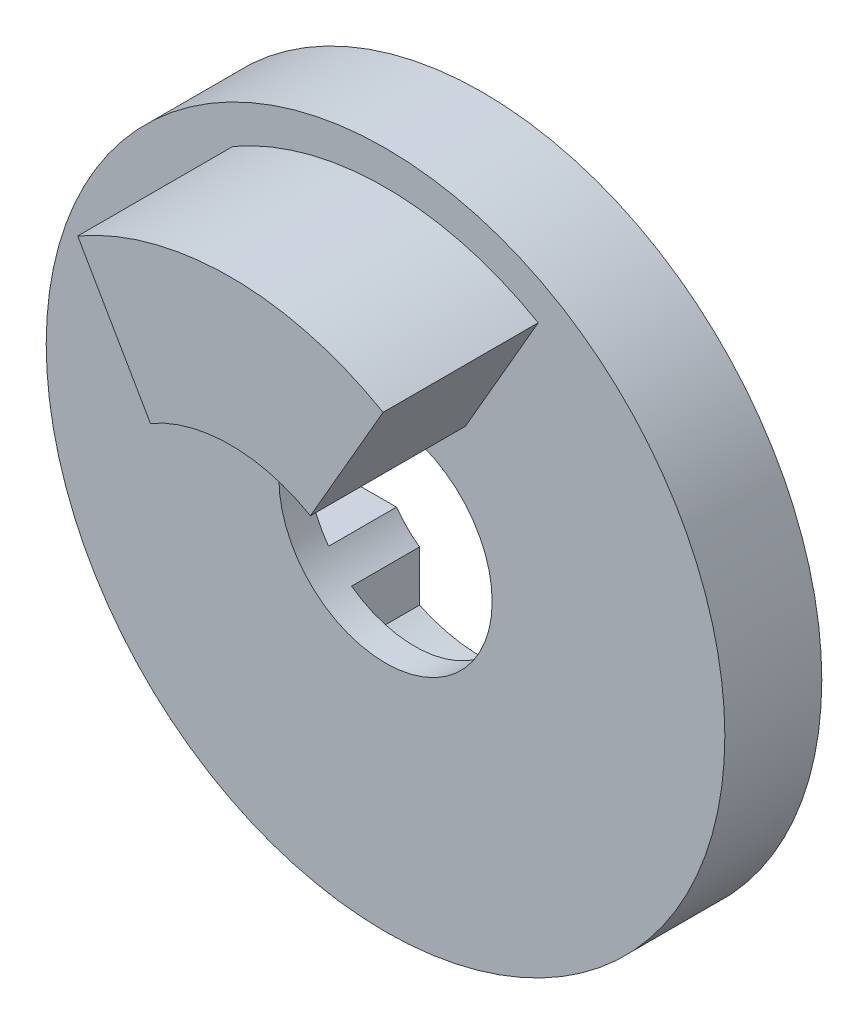
ISO-10303-21;
HEADER;
FILE_DESCRIPTION(('STEP AP214'),'2;1');
FILE_NAME('part.step','',(''),(''),'','','');
FILE_SCHEMA(('AUTOMOTIVE_DESIGN { 1 0 10303 214 1 1 1 1 }'));
ENDSEC;
DATA;
#1=APPLICATION_CONTEXT('core data for automotive mechanical design processes');
#2=APPLICATION_PROTOCOL_DEFINITION('international standard','automotive_design',2000,#1);
#3=PRODUCT_CONTEXT('',#1,'mechanical');
#4=PRODUCT('Part','Part','',(#3));
#5=PRODUCT_RELATED_PRODUCT_CATEGORY('part','',(#4));
#6=PRODUCT_DEFINITION_FORMATION('','',#4);
#7=PRODUCT_DEFINITION_CONTEXT('part definition',#1,'design');
#8=PRODUCT_DEFINITION('design','',#6,#7);
#9=PRODUCT_DEFINITION_SHAPE('','',#8);
#10=(LENGTH_UNIT() NAMED_UNIT(*) SI_UNIT(.MILLI.,.METRE.));
#11=(NAMED_UNIT(*) PLANE_ANGLE_UNIT() SI_UNIT($,.RADIAN.));
#12=(NAMED_UNIT(*) SI_UNIT($,.STERADIAN.) SOLID_ANGLE_UNIT());
#13=UNCERTAINTY_MEASURE_WITH_UNIT(LENGTH_MEASURE(1.E-05),#10,'distance_accuracy_value','');
#14=(GEOMETRIC_REPRESENTATION_CONTEXT(3) GLOBAL_UNCERTAINTY_ASSIGNED_CONTEXT((#13)) GLOBAL_UNIT_ASSIGNED_CONTEXT((#10,
#11,#12)) REPRESENTATION_CONTEXT('',''));
#15=CARTESIAN_POINT('',(0.,0.,0.));
#16=DIRECTION('',(0.,0.,1.));
#17=DIRECTION('',(1.,0.,0.));
#18=AXIS2_PLACEMENT_3D('',#15,#16,#17);
#19=CARTESIAN_POINT('',(0.,0.,-2.5));
#20=DIRECTION('',(0.,0.,1.));
#21=DIRECTION('',(1.,0.,0.));
#22=AXIS2_PLACEMENT_3D('',#19,#20,#21);
#23=PLANE('',#22);
#24=CARTESIAN_POINT('',(0.,0.,-2.5));
#25=DIRECTION('',(0.,0.,-1.));
#26=DIRECTION('',(1.,0.,0.));
#27=AXIS2_PLACEMENT_3D('',#24,#25,#26);
#28=CIRCLE('',#27,7.75000000000003);
#29=CARTESIAN_POINT('',(-3.25,7.03562363973514,-2.5));
#30=VERTEX_POINT('',#29);
#31=CARTESIAN_POINT('',(3.25,7.03562363973514,-2.5));
#32=VERTEX_POINT('',#31);
#33=EDGE_CURVE('E184',#30,#32,#28,.T.);
#34=ORIENTED_EDGE('',*,*,#33,.F.);
#35=DIRECTION('',(0.,1.,0.));
#36=VECTOR('',#35,1.);
#37=CARTESIAN_POINT('',(-3.25,4.43705983732468,-2.5));
#38=LINE('',#37,#36);
#39=CARTESIAN_POINT('',(-3.25,4.43705983732468,-2.5));
#40=VERTEX_POINT('',#39);
#41=EDGE_CURVE('E197',#40,#30,#38,.T.);
#42=ORIENTED_EDGE('',*,*,#41,.F.);
#43=CARTESIAN_POINT('',(0.,0.,-2.5));
#44=DIRECTION('',(0.,0.,1.));
#45=DIRECTION('',(1.,0.,0.));
#46=AXIS2_PLACEMENT_3D('',#43,#44,#45);
#47=CIRCLE('',#46,5.5);
#48=CARTESIAN_POINT('',(-4.43705983732471,3.25,-2.5));
#49=VERTEX_POINT('',#48);
#50=EDGE_CURVE('E301',#40,#49,#47,.T.);
#51=ORIENTED_EDGE('',*,*,#50,.T.);
#52=DIRECTION('',(1.,0.,0.));
#53=VECTOR('',#52,1.);
#54=CARTESIAN_POINT('',(-4.43705983732471,3.25,-2.5));
#55=LINE('',#54,#53);
#56=CARTESIAN_POINT('',(-7.03562363973515,3.25,-2.5));
#57=VERTEX_POINT('',#56);
#58=EDGE_CURVE('E285',#57,#49,#55,.T.);
#59=ORIENTED_EDGE('',*,*,#58,.F.);
#60=CARTESIAN_POINT('',(0.,0.,-2.5));
#61=DIRECTION('',(0.,0.,-1.));
#62=DIRECTION('',(1.,0.,0.));
#63=AXIS2_PLACEMENT_3D('',#60,#61,#62);
#64=CIRCLE('',#63,7.75);
#65=CARTESIAN_POINT('',(-7.03562363973515,-3.25,-2.5));
#66=VERTEX_POINT('',#65);
#67=EDGE_CURVE('E282',#66,#57,#64,.T.);
#68=ORIENTED_EDGE('',*,*,#67,.F.);
#69=DIRECTION('',(-1.,0.,0.));
#70=VECTOR('',#69,1.);
#71=CARTESIAN_POINT('',(-7.03562363973515,-3.25,-2.5));
#72=LINE('',#71,#70);
#73=CARTESIAN_POINT('',(-4.43705983732471,-3.25,-2.5));
#74=VERTEX_POINT('',#73);
#75=EDGE_CURVE('E274',#74,#66,#72,.T.);
#76=ORIENTED_EDGE('',*,*,#75,.F.);
#77=CARTESIAN_POINT('',(-3.25,-4.43705983732474,-2.5));
#78=VERTEX_POINT('',#77);
#79=EDGE_CURVE('E653',#74,#78,#47,.T.);
#80=ORIENTED_EDGE('',*,*,#79,.T.);
#81=DIRECTION('',(0.,1.,0.));
#82=VECTOR('',#81,1.);
#83=CARTESIAN_POINT('',(-3.25,-4.43705983732474,-2.5));
#84=LINE('',#83,#82);
#85=CARTESIAN_POINT('',(-3.25,-7.03562363973515,-2.5));
#86=VERTEX_POINT('',#85);
#87=EDGE_CURVE('E220',#86,#78,#84,.T.);
#88=ORIENTED_EDGE('',*,*,#87,.F.);
#89=CARTESIAN_POINT('',(0.,0.,-2.5));
#90=DIRECTION('',(0.,0.,-1.));
#91=DIRECTION('',(-1.,0.,0.));
#92=AXIS2_PLACEMENT_3D('',#89,#90,#91);
#93=CIRCLE('',#92,7.74999999999997);
#94=CARTESIAN_POINT('',(3.25,-7.03562363973514,-2.5));
#95=VERTEX_POINT('',#94);
#96=EDGE_CURVE('E230',#95,#86,#93,.T.);
#97=ORIENTED_EDGE('',*,*,#96,.F.);
#98=DIRECTION('',(0.,-1.,0.));
#99=VECTOR('',#98,1.);
#100=CARTESIAN_POINT('',(3.25,-7.03562363973514,-2.5));
#101=LINE('',#100,#99);
#102=CARTESIAN_POINT('',(3.25,-4.43705983732474,-2.5));
#103=VERTEX_POINT('',#102);
#104=EDGE_CURVE('E227',#103,#95,#101,.T.);
#105=ORIENTED_EDGE('',*,*,#104,.F.);
#106=CARTESIAN_POINT('',(4.43705983732471,-3.25,-2.5));
#107=VERTEX_POINT('',#106);
#108=EDGE_CURVE('E213',#103,#107,#47,.T.);
#109=ORIENTED_EDGE('',*,*,#108,.T.);
#110=DIRECTION('',(-1.,0.,0.));
#111=VECTOR('',#110,1.);
#112=CARTESIAN_POINT('',(7.03562363973514,-3.25,-2.5));
#113=LINE('',#112,#111);
#114=CARTESIAN_POINT('',(7.03562363973514,-3.25,-2.5));
#115=VERTEX_POINT('',#114);
#116=EDGE_CURVE('E246',#115,#107,#113,.T.);
#117=ORIENTED_EDGE('',*,*,#116,.F.);
#118=CARTESIAN_POINT('',(0.,0.,-2.5));
#119=DIRECTION('',(0.,0.,-1.));
#120=DIRECTION('',(-1.,0.,0.));
#121=AXIS2_PLACEMENT_3D('',#118,#119,#120);
#122=CIRCLE('',#121,7.75);
#123=CARTESIAN_POINT('',(7.03562363973514,3.25,-2.5));
#124=VERTEX_POINT('',#123);
#125=EDGE_CURVE('E258',#124,#115,#122,.T.);
#126=ORIENTED_EDGE('',*,*,#125,.F.);
#127=DIRECTION('',(1.,0.,0.));
#128=VECTOR('',#127,1.);
#129=CARTESIAN_POINT('',(4.43705983732471,3.25,-2.5));
#130=LINE('',#129,#128);
#131=CARTESIAN_POINT('',(4.43705983732471,3.25,-2.5));
#132=VERTEX_POINT('',#131);
#133=EDGE_CURVE('E255',#132,#124,#130,.T.);
#134=ORIENTED_EDGE('',*,*,#133,.F.);
#135=CARTESIAN_POINT('',(3.25,4.43705983732468,-2.5));
#136=VERTEX_POINT('',#135);
#137=EDGE_CURVE('E297',#132,#136,#47,.T.);
#138=ORIENTED_EDGE('',*,*,#137,.T.);
#139=DIRECTION('',(0.,-1.,0.));
#140=VECTOR('',#139,1.);
#141=CARTESIAN_POINT('',(3.25,7.03562363973514,-2.5));
#142=LINE('',#141,#140);
#143=EDGE_CURVE('E200',#32,#136,#142,.T.);
#144=ORIENTED_EDGE('',*,*,#143,.F.);
#145=EDGE_LOOP('',(#34,#42,#51,#59,#68,#76,#80,#88,#97,#105,#109,#117,#126,#134,#138,#144));
#146=FACE_BOUND('',#145,.T.);
#147=CARTESIAN_POINT('',(0.,0.,-2.5));
#148=DIRECTION('',(0.,0.,-1.));
#149=DIRECTION('',(-1.,0.,0.));
#150=AXIS2_PLACEMENT_3D('',#147,#148,#149);
#151=CIRCLE('',#150,8.);
#152=CARTESIAN_POINT('',(-8.,0.,-2.5));
#153=VERTEX_POINT('',#152);
#154=EDGE_CURVE('E363',#153,#153,#151,.T.);
#155=ORIENTED_EDGE('',*,*,#154,.T.);
#156=EDGE_LOOP('',(#155));
#157=FACE_BOUND('',#156,.T.);
#158=ADVANCED_FACE('F39',(#146,#157),#23,.F.);
#159=CARTESIAN_POINT('',(0.,0.,2.5));
#160=DIRECTION('',(0.,0.,1.));
#161=DIRECTION('',(1.,0.,0.));
#162=AXIS2_PLACEMENT_3D('',#159,#160,#161);
#163=PLANE('',#162);
#164=CARTESIAN_POINT('',(0.,0.,2.5));
#165=DIRECTION('',(0.,0.,1.));
#166=DIRECTION('',(1.,0.,0.));
#167=AXIS2_PLACEMENT_3D('',#164,#165,#166);
#168=CIRCLE('',#167,5.5);
#169=CARTESIAN_POINT('',(5.5,0.,2.5));
#170=VERTEX_POINT('',#169);
#171=EDGE_CURVE('E300',#170,#170,#168,.T.);
#172=ORIENTED_EDGE('',*,*,#171,.F.);
#173=EDGE_LOOP('',(#172));
#174=FACE_BOUND('',#173,.T.);
#175=CARTESIAN_POINT('',(0.,0.,2.5));
#176=DIRECTION('',(0.,0.,1.));
#177=DIRECTION('',(1.,0.,0.));
#178=AXIS2_PLACEMENT_3D('',#175,#176,#177);
#179=CIRCLE('',#178,17.5);
#180=CARTESIAN_POINT('',(17.5,0.,2.5));
#181=VERTEX_POINT('',#180);
#182=EDGE_CURVE('E11',#181,#181,#179,.T.);
#183=ORIENTED_EDGE('',*,*,#182,.T.);
#184=EDGE_LOOP('',(#183));
#185=FACE_BOUND('',#184,.T.);
#186=DIRECTION('',(0.499999999999996,-0.866025403784441,0.));
#187=VECTOR('',#186,1.);
#188=CARTESIAN_POINT('',(-4.12499999999996,7.14470958122165,2.5));
#189=LINE('',#188,#187);
#190=CARTESIAN_POINT('',(-7.87499999999993,13.639900109605,2.5));
#191=VERTEX_POINT('',#190);
#192=CARTESIAN_POINT('',(-4.12499999999996,7.14470958122165,2.5));
#193=VERTEX_POINT('',#192);
#194=EDGE_CURVE('E318',#191,#193,#189,.T.);
#195=ORIENTED_EDGE('',*,*,#194,.F.);
#196=CARTESIAN_POINT('',(0.,0.,2.5));
#197=DIRECTION('',(0.,0.,1.));
#198=DIRECTION('',(-1.,0.,0.));
#199=AXIS2_PLACEMENT_3D('',#196,#197,#198);
#200=CIRCLE('',#199,15.75);
#201=CARTESIAN_POINT('',(7.87499999999993,13.639900109605,2.5));
#202=VERTEX_POINT('',#201);
#203=EDGE_CURVE('E304',#202,#191,#200,.T.);
#204=ORIENTED_EDGE('',*,*,#203,.F.);
#205=DIRECTION('',(0.499999999999995,0.866025403784441,0.));
#206=VECTOR('',#205,1.);
#207=CARTESIAN_POINT('',(7.87499999999993,13.639900109605,2.5));
#208=LINE('',#207,#206);
#209=CARTESIAN_POINT('',(4.12499999999996,7.14470958122164,2.5));
#210=VERTEX_POINT('',#209);
#211=EDGE_CURVE('E309',#210,#202,#208,.T.);
#212=ORIENTED_EDGE('',*,*,#211,.F.);
#213=CARTESIAN_POINT('',(0.,0.,2.5));
#214=DIRECTION('',(0.,0.,-1.));
#215=DIRECTION('',(1.,0.,0.));
#216=AXIS2_PLACEMENT_3D('',#213,#214,#215);
#217=CIRCLE('',#216,8.25);
#218=EDGE_CURVE('E320',#193,#210,#217,.T.);
#219=ORIENTED_EDGE('',*,*,#218,.F.);
#220=EDGE_LOOP('',(#195,#204,#212,#219));
#221=FACE_BOUND('',#220,.T.);
#222=ADVANCED_FACE('F349',(#174,#185,#221),#163,.T.);
#223=CARTESIAN_POINT('',(0.,0.,2.5));
#224=DIRECTION('',(0.,0.,-1.));
#225=DIRECTION('',(-1.,0.,0.));
#226=AXIS2_PLACEMENT_3D('',#223,#224,#225);
#227=CYLINDRICAL_SURFACE('',#226,17.5);
#228=ORIENTED_EDGE('',*,*,#182,.F.);
#229=EDGE_LOOP('',(#228));
#230=FACE_BOUND('',#229,.T.);
#231=CARTESIAN_POINT('',(0.,0.,-2.5));
#232=DIRECTION('',(0.,0.,1.));
#233=DIRECTION('',(1.,0.,0.));
#234=AXIS2_PLACEMENT_3D('',#231,#232,#233);
#235=CIRCLE('',#234,17.5);
#236=CARTESIAN_POINT('',(17.5,0.,-2.5));
#237=VERTEX_POINT('',#236);
#238=EDGE_CURVE('E43',#237,#237,#235,.T.);
#239=ORIENTED_EDGE('',*,*,#238,.T.);
#240=EDGE_LOOP('',(#239));
#241=FACE_BOUND('',#240,.T.);
#242=ADVANCED_FACE('F41',(#230,#241),#227,.T.);
#243=CARTESIAN_POINT('',(0.,0.,-2.5));
#244=DIRECTION('',(0.,0.,-1.));
#245=DIRECTION('',(-1.,0.,0.));
#246=AXIS2_PLACEMENT_3D('',#243,#244,#245);
#247=CIRCLE('',#246,13.);
#248=CARTESIAN_POINT('',(-13.,0.,-2.5));
#249=VERTEX_POINT('',#248);
#250=EDGE_CURVE('E203',#249,#249,#247,.T.);
#251=ORIENTED_EDGE('',*,*,#250,.F.);
#252=EDGE_LOOP('',(#251));
#253=FACE_BOUND('',#252,.T.);
#254=ORIENTED_EDGE('',*,*,#238,.F.);
#255=EDGE_LOOP('',(#254));
#256=FACE_BOUND('',#255,.T.);
#257=ADVANCED_FACE('F338',(#253,#256),#23,.F.);
#258=CARTESIAN_POINT('',(0.,0.,10.5));
#259=DIRECTION('',(0.,0.,-1.));
#260=DIRECTION('',(-1.,0.,0.));
#261=AXIS2_PLACEMENT_3D('',#258,#259,#260);
#262=CYLINDRICAL_SURFACE('',#261,15.75);
#263=ORIENTED_EDGE('',*,*,#203,.T.);
#264=DIRECTION('',(0.,0.,-1.));
#265=VECTOR('',#264,1.);
#266=CARTESIAN_POINT('',(-7.87499999999993,13.639900109605,10.5));
#267=LINE('',#266,#265);
#268=CARTESIAN_POINT('',(-7.87499999999993,13.639900109605,10.5));
#269=VERTEX_POINT('',#268);
#270=EDGE_CURVE('E331',#269,#191,#267,.T.);
#271=ORIENTED_EDGE('',*,*,#270,.F.);
#272=CARTESIAN_POINT('',(0.,0.,10.5));
#273=DIRECTION('',(0.,0.,1.));
#274=DIRECTION('',(-1.,0.,0.));
#275=AXIS2_PLACEMENT_3D('',#272,#273,#274);
#276=CIRCLE('',#275,15.75);
#277=CARTESIAN_POINT('',(7.87499999999993,13.639900109605,10.5));
#278=VERTEX_POINT('',#277);
#279=EDGE_CURVE('E305',#278,#269,#276,.T.);
#280=ORIENTED_EDGE('',*,*,#279,.F.);
#281=DIRECTION('',(0.,0.,-1.));
#282=VECTOR('',#281,1.);
#283=CARTESIAN_POINT('',(7.87499999999993,13.639900109605,10.5));
#284=LINE('',#283,#282);
#285=EDGE_CURVE('E315',#278,#202,#284,.T.);
#286=ORIENTED_EDGE('',*,*,#285,.T.);
#287=EDGE_LOOP('',(#263,#271,#280,#286));
#288=FACE_BOUND('',#287,.T.);
#289=ADVANCED_FACE('F340',(#288),#262,.T.);
#290=CARTESIAN_POINT('',(-4.12499999999996,7.14470958122165,10.5));
#291=DIRECTION('',(0.866025403784441,0.499999999999996,0.));
#292=DIRECTION('',(-0.499999999999996,0.866025403784441,0.));
#293=AXIS2_PLACEMENT_3D('',#290,#291,#292);
#294=PLANE('',#293);
#295=ORIENTED_EDGE('',*,*,#194,.T.);
#296=DIRECTION('',(0.,0.,-1.));
#297=VECTOR('',#296,1.);
#298=CARTESIAN_POINT('',(-4.12499999999996,7.14470958122165,10.5));
#299=LINE('',#298,#297);
#300=CARTESIAN_POINT('',(-4.12499999999996,7.14470958122165,10.5));
#301=VERTEX_POINT('',#300);
#302=EDGE_CURVE('E328',#301,#193,#299,.T.);
#303=ORIENTED_EDGE('',*,*,#302,.F.);
#304=DIRECTION('',(0.499999999999996,-0.866025403784441,0.));
#305=VECTOR('',#304,1.);
#306=CARTESIAN_POINT('',(-4.12499999999996,7.14470958122165,10.5));
#307=LINE('',#306,#305);
#308=EDGE_CURVE('E308',#269,#301,#307,.T.);
#309=ORIENTED_EDGE('',*,*,#308,.F.);
#310=ORIENTED_EDGE('',*,*,#270,.T.);
#311=EDGE_LOOP('',(#295,#303,#309,#310));
#312=FACE_BOUND('',#311,.T.);
#313=ADVANCED_FACE('F346',(#312),#294,.F.);
#314=CARTESIAN_POINT('',(0.,0.,10.5));
#315=DIRECTION('',(0.,0.,-1.));
#316=DIRECTION('',(-1.,0.,0.));
#317=AXIS2_PLACEMENT_3D('',#314,#315,#316);
#318=CYLINDRICAL_SURFACE('',#317,8.25);
#319=ORIENTED_EDGE('',*,*,#218,.T.);
#320=DIRECTION('',(0.,0.,-1.));
#321=VECTOR('',#320,1.);
#322=CARTESIAN_POINT('',(4.12499999999996,7.14470958122164,10.5));
#323=LINE('',#322,#321);
#324=CARTESIAN_POINT('',(4.12499999999996,7.14470958122164,10.5));
#325=VERTEX_POINT('',#324);
#326=EDGE_CURVE('E326',#325,#210,#323,.T.);
#327=ORIENTED_EDGE('',*,*,#326,.F.);
#328=CARTESIAN_POINT('',(0.,0.,10.5));
#329=DIRECTION('',(0.,0.,-1.));
#330=DIRECTION('',(1.,0.,0.));
#331=AXIS2_PLACEMENT_3D('',#328,#329,#330);
#332=CIRCLE('',#331,8.25);
#333=EDGE_CURVE('E311',#301,#325,#332,.T.);
#334=ORIENTED_EDGE('',*,*,#333,.F.);
#335=ORIENTED_EDGE('',*,*,#302,.T.);
#336=EDGE_LOOP('',(#319,#327,#334,#335));
#337=FACE_BOUND('',#336,.T.);
#338=ADVANCED_FACE('F455',(#337),#318,.F.);
#339=CARTESIAN_POINT('',(7.87499999999993,13.639900109605,10.5));
#340=DIRECTION('',(-0.866025403784441,0.499999999999995,0.));
#341=DIRECTION('',(-0.499999999999995,-0.866025403784441,0.));
#342=AXIS2_PLACEMENT_3D('',#339,#340,#341);
#343=PLANE('',#342);
#344=ORIENTED_EDGE('',*,*,#211,.T.);
#345=ORIENTED_EDGE('',*,*,#285,.F.);
#346=DIRECTION('',(0.499999999999995,0.866025403784441,0.));
#347=VECTOR('',#346,1.);
#348=CARTESIAN_POINT('',(7.87499999999993,13.639900109605,10.5));
#349=LINE('',#348,#347);
#350=EDGE_CURVE('E313',#325,#278,#349,.T.);
#351=ORIENTED_EDGE('',*,*,#350,.F.);
#352=ORIENTED_EDGE('',*,*,#326,.T.);
#353=EDGE_LOOP('',(#344,#345,#351,#352));
#354=FACE_BOUND('',#353,.T.);
#355=ADVANCED_FACE('F451',(#354),#343,.F.);
#356=CARTESIAN_POINT('',(0.,0.,10.5));
#357=DIRECTION('',(0.,0.,-1.));
#358=DIRECTION('',(-1.,0.,0.));
#359=AXIS2_PLACEMENT_3D('',#356,#357,#358);
#360=PLANE('',#359);
#361=ORIENTED_EDGE('',*,*,#279,.T.);
#362=ORIENTED_EDGE('',*,*,#308,.T.);
#363=ORIENTED_EDGE('',*,*,#333,.T.);
#364=ORIENTED_EDGE('',*,*,#350,.T.);
#365=EDGE_LOOP('',(#361,#362,#363,#364));
#366=FACE_BOUND('',#365,.T.);
#367=ADVANCED_FACE('F447',(#366),#360,.F.);
#368=CARTESIAN_POINT('',(0.,0.,-2.5));
#369=DIRECTION('',(0.,0.,1.));
#370=DIRECTION('',(1.,0.,0.));
#371=AXIS2_PLACEMENT_3D('',#368,#369,#370);
#372=CYLINDRICAL_SURFACE('',#371,5.5);
#373=ORIENTED_EDGE('',*,*,#50,.F.);
#374=DIRECTION('',(0.,0.,-1.));
#375=VECTOR('',#374,1.);
#376=CARTESIAN_POINT('',(-3.25,4.43705983732468,1.));
#377=LINE('',#376,#375);
#378=CARTESIAN_POINT('',(-3.25,4.43705983732468,1.));
#379=VERTEX_POINT('',#378);
#380=EDGE_CURVE('E214',#379,#40,#377,.T.);
#381=ORIENTED_EDGE('',*,*,#380,.F.);
#382=CARTESIAN_POINT('',(0.,0.,1.));
#383=DIRECTION('',(0.,0.,1.));
#384=DIRECTION('',(1.,0.,0.));
#385=AXIS2_PLACEMENT_3D('',#382,#383,#384);
#386=CIRCLE('',#385,5.5);
#387=CARTESIAN_POINT('',(3.25000000000002,4.4370598373247,1.));
#388=VERTEX_POINT('',#387);
#389=EDGE_CURVE('E193',#388,#379,#386,.T.);
#390=ORIENTED_EDGE('',*,*,#389,.F.);
#391=DIRECTION('',(0.,0.,-1.));
#392=VECTOR('',#391,1.);
#393=CARTESIAN_POINT('',(3.25,4.43705983732468,1.));
#394=LINE('',#393,#392);
#395=EDGE_CURVE('E187',#388,#136,#394,.T.);
#396=ORIENTED_EDGE('',*,*,#395,.T.);
#397=ORIENTED_EDGE('',*,*,#137,.F.);
#398=DIRECTION('',(0.,0.,-1.));
#399=VECTOR('',#398,1.);
#400=CARTESIAN_POINT('',(4.43705983732471,3.25,1.));
#401=LINE('',#400,#399);
#402=CARTESIAN_POINT('',(4.43705983732471,3.25,1.));
#403=VERTEX_POINT('',#402);
#404=EDGE_CURVE('E254',#403,#132,#401,.T.);
#405=ORIENTED_EDGE('',*,*,#404,.F.);
#406=CARTESIAN_POINT('',(0.,0.,1.));
#407=DIRECTION('',(0.,0.,1.));
#408=DIRECTION('',(-1.,0.,0.));
#409=AXIS2_PLACEMENT_3D('',#406,#407,#408);
#410=CIRCLE('',#409,5.5);
#411=CARTESIAN_POINT('',(4.43705983732471,-3.25,1.));
#412=VERTEX_POINT('',#411);
#413=EDGE_CURVE('E242',#412,#403,#410,.T.);
#414=ORIENTED_EDGE('',*,*,#413,.F.);
#415=DIRECTION('',(0.,0.,-1.));
#416=VECTOR('',#415,1.);
#417=CARTESIAN_POINT('',(4.43705983732471,-3.25,1.));
#418=LINE('',#417,#416);
#419=EDGE_CURVE('E231',#412,#107,#418,.T.);
#420=ORIENTED_EDGE('',*,*,#419,.T.);
#421=ORIENTED_EDGE('',*,*,#108,.F.);
#422=DIRECTION('',(0.,0.,-1.));
#423=VECTOR('',#422,1.);
#424=CARTESIAN_POINT('',(3.25,-4.43705983732474,1.));
#425=LINE('',#424,#423);
#426=CARTESIAN_POINT('',(3.25,-4.43705983732474,1.));
#427=VERTEX_POINT('',#426);
#428=EDGE_CURVE('E226',#427,#103,#425,.T.);
#429=ORIENTED_EDGE('',*,*,#428,.F.);
#430=CARTESIAN_POINT('',(0.,0.,1.));
#431=DIRECTION('',(0.,0.,1.));
#432=DIRECTION('',(-1.,0.,0.));
#433=AXIS2_PLACEMENT_3D('',#430,#431,#432);
#434=CIRCLE('',#433,5.5);
#435=CARTESIAN_POINT('',(-3.24999999999998,-4.43705983732472,1.));
#436=VERTEX_POINT('',#435);
#437=EDGE_CURVE('E217',#436,#427,#434,.T.);
#438=ORIENTED_EDGE('',*,*,#437,.F.);
#439=DIRECTION('',(0.,0.,-1.));
#440=VECTOR('',#439,1.);
#441=CARTESIAN_POINT('',(-3.25,-4.43705983732474,1.));
#442=LINE('',#441,#440);
#443=EDGE_CURVE('E209',#436,#78,#442,.T.);
#444=ORIENTED_EDGE('',*,*,#443,.T.);
#445=ORIENTED_EDGE('',*,*,#79,.F.);
#446=DIRECTION('',(0.,0.,-1.));
#447=VECTOR('',#446,1.);
#448=CARTESIAN_POINT('',(-4.43705983732471,-3.25,1.));
#449=LINE('',#448,#447);
#450=CARTESIAN_POINT('',(-4.43705983732471,-3.25,1.));
#451=VERTEX_POINT('',#450);
#452=EDGE_CURVE('E291',#451,#74,#449,.T.);
#453=ORIENTED_EDGE('',*,*,#452,.F.);
#454=CARTESIAN_POINT('',(0.,0.,1.));
#455=DIRECTION('',(0.,0.,1.));
#456=DIRECTION('',(1.,0.,0.));
#457=AXIS2_PLACEMENT_3D('',#454,#455,#456);
#458=CIRCLE('',#457,5.5);
#459=CARTESIAN_POINT('',(-4.43705983732471,3.25,1.));
#460=VERTEX_POINT('',#459);
#461=EDGE_CURVE('E276',#460,#451,#458,.T.);
#462=ORIENTED_EDGE('',*,*,#461,.F.);
#463=DIRECTION('',(0.,0.,-1.));
#464=VECTOR('',#463,1.);
#465=CARTESIAN_POINT('',(-4.43705983732471,3.25,1.));
#466=LINE('',#465,#464);
#467=EDGE_CURVE('E293',#460,#49,#466,.T.);
#468=ORIENTED_EDGE('',*,*,#467,.T.);
#469=EDGE_LOOP('',(#373,#381,#390,#396,#397,#405,#414,#420,#421,#429,#438,#444,#445,#453,#462,#468));
#470=FACE_BOUND('',#469,.T.);
#471=ORIENTED_EDGE('',*,*,#171,.T.);
#472=EDGE_LOOP('',(#471));
#473=FACE_BOUND('',#472,.T.);
#474=ADVANCED_FACE('F443',(#470,#473),#372,.F.);
#475=CARTESIAN_POINT('',(0.,0.,1.));
#476=DIRECTION('',(0.,0.,-1.));
#477=DIRECTION('',(-1.,0.,0.));
#478=AXIS2_PLACEMENT_3D('',#475,#476,#477);
#479=CYLINDRICAL_SURFACE('',#478,7.75);
#480=ORIENTED_EDGE('',*,*,#67,.T.);
#481=DIRECTION('',(0.,0.,-1.));
#482=VECTOR('',#481,1.);
#483=CARTESIAN_POINT('',(-7.03562363973515,3.25,1.));
#484=LINE('',#483,#482);
#485=CARTESIAN_POINT('',(-7.03562363973515,3.25,1.));
#486=VERTEX_POINT('',#485);
#487=EDGE_CURVE('E281',#486,#57,#484,.T.);
#488=ORIENTED_EDGE('',*,*,#487,.F.);
#489=CARTESIAN_POINT('',(0.,0.,1.));
#490=DIRECTION('',(0.,0.,-1.));
#491=DIRECTION('',(1.,0.,0.));
#492=AXIS2_PLACEMENT_3D('',#489,#490,#491);
#493=CIRCLE('',#492,7.75);
#494=CARTESIAN_POINT('',(-7.03562363973515,-3.25,1.));
#495=VERTEX_POINT('',#494);
#496=EDGE_CURVE('E270',#495,#486,#493,.T.);
#497=ORIENTED_EDGE('',*,*,#496,.F.);
#498=DIRECTION('',(0.,0.,-1.));
#499=VECTOR('',#498,1.);
#500=CARTESIAN_POINT('',(-7.03562363973515,-3.25,1.));
#501=LINE('',#500,#499);
#502=EDGE_CURVE('E259',#495,#66,#501,.T.);
#503=ORIENTED_EDGE('',*,*,#502,.T.);
#504=EDGE_LOOP('',(#480,#488,#497,#503));
#505=FACE_BOUND('',#504,.T.);
#506=ADVANCED_FACE('F436',(#505),#479,.F.);
#507=CARTESIAN_POINT('',(-7.03562363973515,-3.25,1.));
#508=DIRECTION('',(0.,-1.,0.));
#509=DIRECTION('',(0.,0.,-1.));
#510=AXIS2_PLACEMENT_3D('',#507,#508,#509);
#511=PLANE('',#510);
#512=ORIENTED_EDGE('',*,*,#75,.T.);
#513=ORIENTED_EDGE('',*,*,#502,.F.);
#514=DIRECTION('',(-1.,0.,0.));
#515=VECTOR('',#514,1.);
#516=CARTESIAN_POINT('',(-7.03562363973515,-3.25,1.));
#517=LINE('',#516,#515);
#518=EDGE_CURVE('E278',#451,#495,#517,.T.);
#519=ORIENTED_EDGE('',*,*,#518,.F.);
#520=ORIENTED_EDGE('',*,*,#452,.T.);
#521=EDGE_LOOP('',(#512,#513,#519,#520));
#522=FACE_BOUND('',#521,.T.);
#523=ADVANCED_FACE('F433',(#522),#511,.F.);
#524=CARTESIAN_POINT('',(-4.43705983732471,3.25,1.));
#525=DIRECTION('',(0.,1.,0.));
#526=DIRECTION('',(0.,0.,1.));
#527=AXIS2_PLACEMENT_3D('',#524,#525,#526);
#528=PLANE('',#527);
#529=ORIENTED_EDGE('',*,*,#58,.T.);
#530=ORIENTED_EDGE('',*,*,#467,.F.);
#531=DIRECTION('',(1.,0.,0.));
#532=VECTOR('',#531,1.);
#533=CARTESIAN_POINT('',(-4.43705983732471,3.25,1.));
#534=LINE('',#533,#532);
#535=EDGE_CURVE('E273',#486,#460,#534,.T.);
#536=ORIENTED_EDGE('',*,*,#535,.F.);
#537=ORIENTED_EDGE('',*,*,#487,.T.);
#538=EDGE_LOOP('',(#529,#530,#536,#537));
#539=FACE_BOUND('',#538,.T.);
#540=ADVANCED_FACE('F431',(#539),#528,.F.);
#541=CARTESIAN_POINT('',(0.,0.,1.));
#542=DIRECTION('',(0.,0.,1.));
#543=DIRECTION('',(1.,0.,0.));
#544=AXIS2_PLACEMENT_3D('',#541,#542,#543);
#545=PLANE('',#544);
#546=ORIENTED_EDGE('',*,*,#496,.T.);
#547=ORIENTED_EDGE('',*,*,#535,.T.);
#548=ORIENTED_EDGE('',*,*,#461,.T.);
#549=ORIENTED_EDGE('',*,*,#518,.T.);
#550=EDGE_LOOP('',(#546,#547,#548,#549));
#551=FACE_BOUND('',#550,.T.);
#552=ADVANCED_FACE('F421',(#551),#545,.F.);
#553=CARTESIAN_POINT('',(7.03562363973514,-3.25,1.));
#554=DIRECTION('',(0.,-1.,0.));
#555=DIRECTION('',(0.,0.,-1.));
#556=AXIS2_PLACEMENT_3D('',#553,#554,#555);
#557=PLANE('',#556);
#558=ORIENTED_EDGE('',*,*,#116,.T.);
#559=ORIENTED_EDGE('',*,*,#419,.F.);
#560=DIRECTION('',(-1.,0.,0.));
#561=VECTOR('',#560,1.);
#562=CARTESIAN_POINT('',(7.03562363973514,-3.25,1.));
#563=LINE('',#562,#561);
#564=CARTESIAN_POINT('',(7.03562363973514,-3.25,1.));
#565=VERTEX_POINT('',#564);
#566=EDGE_CURVE('E252',#565,#412,#563,.T.);
#567=ORIENTED_EDGE('',*,*,#566,.F.);
#568=DIRECTION('',(0.,0.,-1.));
#569=VECTOR('',#568,1.);
#570=CARTESIAN_POINT('',(7.03562363973514,-3.25,1.));
#571=LINE('',#570,#569);
#572=EDGE_CURVE('E265',#565,#115,#571,.T.);
#573=ORIENTED_EDGE('',*,*,#572,.T.);
#574=EDGE_LOOP('',(#558,#559,#567,#573));
#575=FACE_BOUND('',#574,.T.);
#576=ADVANCED_FACE('F417',(#575),#557,.F.);
#577=CARTESIAN_POINT('',(0.,0.,1.));
#578=DIRECTION('',(0.,0.,-1.));
#579=DIRECTION('',(-1.,0.,0.));
#580=AXIS2_PLACEMENT_3D('',#577,#578,#579);
#581=CYLINDRICAL_SURFACE('',#580,7.75);
#582=ORIENTED_EDGE('',*,*,#125,.T.);
#583=ORIENTED_EDGE('',*,*,#572,.F.);
#584=CARTESIAN_POINT('',(0.,0.,1.));
#585=DIRECTION('',(0.,0.,-1.));
#586=DIRECTION('',(-1.,0.,0.));
#587=AXIS2_PLACEMENT_3D('',#584,#585,#586);
#588=CIRCLE('',#587,7.75);
#589=CARTESIAN_POINT('',(7.03562363973514,3.25,1.));
#590=VERTEX_POINT('',#589);
#591=EDGE_CURVE('E249',#590,#565,#588,.T.);
#592=ORIENTED_EDGE('',*,*,#591,.F.);
#593=DIRECTION('',(0.,0.,-1.));
#594=VECTOR('',#593,1.);
#595=CARTESIAN_POINT('',(7.03562363973514,3.25,1.));
#596=LINE('',#595,#594);
#597=EDGE_CURVE('E267',#590,#124,#596,.T.);
#598=ORIENTED_EDGE('',*,*,#597,.T.);
#599=EDGE_LOOP('',(#582,#583,#592,#598));
#600=FACE_BOUND('',#599,.T.);
#601=ADVANCED_FACE('F420',(#600),#581,.F.);
#602=CARTESIAN_POINT('',(4.43705983732471,3.25,1.));
#603=DIRECTION('',(0.,1.,0.));
#604=DIRECTION('',(0.,0.,1.));
#605=AXIS2_PLACEMENT_3D('',#602,#603,#604);
#606=PLANE('',#605);
#607=ORIENTED_EDGE('',*,*,#133,.T.);
#608=ORIENTED_EDGE('',*,*,#597,.F.);
#609=DIRECTION('',(1.,0.,0.));
#610=VECTOR('',#609,1.);
#611=CARTESIAN_POINT('',(4.43705983732471,3.25,1.));
#612=LINE('',#611,#610);
#613=EDGE_CURVE('E245',#403,#590,#612,.T.);
#614=ORIENTED_EDGE('',*,*,#613,.F.);
#615=ORIENTED_EDGE('',*,*,#404,.T.);
#616=EDGE_LOOP('',(#607,#608,#614,#615));
#617=FACE_BOUND('',#616,.T.);
#618=ADVANCED_FACE('F415',(#617),#606,.F.);
#619=CARTESIAN_POINT('',(0.,0.,1.));
#620=DIRECTION('',(0.,0.,-1.));
#621=DIRECTION('',(-1.,0.,0.));
#622=AXIS2_PLACEMENT_3D('',#619,#620,#621);
#623=PLANE('',#622);
#624=ORIENTED_EDGE('',*,*,#413,.T.);
#625=ORIENTED_EDGE('',*,*,#613,.T.);
#626=ORIENTED_EDGE('',*,*,#591,.T.);
#627=ORIENTED_EDGE('',*,*,#566,.T.);
#628=EDGE_LOOP('',(#624,#625,#626,#627));
#629=FACE_BOUND('',#628,.T.);
#630=ADVANCED_FACE('F405',(#629),#623,.T.);
#631=CARTESIAN_POINT('',(-3.25,-4.43705983732474,1.));
#632=DIRECTION('',(-1.,0.,0.));
#633=DIRECTION('',(0.,0.,1.));
#634=AXIS2_PLACEMENT_3D('',#631,#632,#633);
#635=PLANE('',#634);
#636=ORIENTED_EDGE('',*,*,#87,.T.);
#637=ORIENTED_EDGE('',*,*,#443,.F.);
#638=DIRECTION('',(0.,1.,0.));
#639=VECTOR('',#638,1.);
#640=CARTESIAN_POINT('',(-3.25,-4.43705983732474,1.));
#641=LINE('',#640,#639);
#642=CARTESIAN_POINT('',(-3.25,-7.03562363973515,1.));
#643=VERTEX_POINT('',#642);
#644=EDGE_CURVE('E62',#643,#436,#641,.T.);
#645=ORIENTED_EDGE('',*,*,#644,.F.);
#646=DIRECTION('',(0.,0.,-1.));
#647=VECTOR('',#646,1.);
#648=CARTESIAN_POINT('',(-3.25,-7.03562363973515,1.));
#649=LINE('',#648,#647);
#650=EDGE_CURVE('E237',#643,#86,#649,.T.);
#651=ORIENTED_EDGE('',*,*,#650,.T.);
#652=EDGE_LOOP('',(#636,#637,#645,#651));
#653=FACE_BOUND('',#652,.T.);
#654=ADVANCED_FACE('F401',(#653),#635,.F.);
#655=CARTESIAN_POINT('',(0.,0.,1.));
#656=DIRECTION('',(0.,0.,-1.));
#657=DIRECTION('',(-1.,0.,0.));
#658=AXIS2_PLACEMENT_3D('',#655,#656,#657);
#659=CYLINDRICAL_SURFACE('',#658,7.74999999999997);
#660=ORIENTED_EDGE('',*,*,#96,.T.);
#661=ORIENTED_EDGE('',*,*,#650,.F.);
#662=CARTESIAN_POINT('',(0.,0.,1.));
#663=DIRECTION('',(0.,0.,-1.));
#664=DIRECTION('',(-1.,0.,0.));
#665=AXIS2_PLACEMENT_3D('',#662,#663,#664);
#666=CIRCLE('',#665,7.74999999999997);
#667=CARTESIAN_POINT('',(3.25,-7.03562363973514,1.));
#668=VERTEX_POINT('',#667);
#669=EDGE_CURVE('E223',#668,#643,#666,.T.);
#670=ORIENTED_EDGE('',*,*,#669,.F.);
#671=DIRECTION('',(0.,0.,-1.));
#672=VECTOR('',#671,1.);
#673=CARTESIAN_POINT('',(3.25,-7.03562363973514,1.));
#674=LINE('',#673,#672);
#675=EDGE_CURVE('E239',#668,#95,#674,.T.);
#676=ORIENTED_EDGE('',*,*,#675,.T.);
#677=EDGE_LOOP('',(#660,#661,#670,#676));
#678=FACE_BOUND('',#677,.T.);
#679=ADVANCED_FACE('F404',(#678),#659,.F.);
#680=CARTESIAN_POINT('',(3.25,-7.03562363973514,1.));
#681=DIRECTION('',(1.,0.,0.));
#682=DIRECTION('',(0.,1.,0.));
#683=AXIS2_PLACEMENT_3D('',#680,#681,#682);
#684=PLANE('',#683);
#685=ORIENTED_EDGE('',*,*,#104,.T.);
#686=ORIENTED_EDGE('',*,*,#675,.F.);
#687=DIRECTION('',(0.,-1.,0.));
#688=VECTOR('',#687,1.);
#689=CARTESIAN_POINT('',(3.25,-7.03562363973514,1.));
#690=LINE('',#689,#688);
#691=EDGE_CURVE('E219',#427,#668,#690,.T.);
#692=ORIENTED_EDGE('',*,*,#691,.F.);
#693=ORIENTED_EDGE('',*,*,#428,.T.);
#694=EDGE_LOOP('',(#685,#686,#692,#693));
#695=FACE_BOUND('',#694,.T.);
#696=ADVANCED_FACE('F400',(#695),#684,.F.);
#697=CARTESIAN_POINT('',(0.,0.,1.));
#698=DIRECTION('',(0.,0.,-1.));
#699=DIRECTION('',(-1.,0.,0.));
#700=AXIS2_PLACEMENT_3D('',#697,#698,#699);
#701=PLANE('',#700);
#702=ORIENTED_EDGE('',*,*,#437,.T.);
#703=ORIENTED_EDGE('',*,*,#691,.T.);
#704=ORIENTED_EDGE('',*,*,#669,.T.);
#705=ORIENTED_EDGE('',*,*,#644,.T.);
#706=EDGE_LOOP('',(#702,#703,#704,#705));
#707=FACE_BOUND('',#706,.T.);
#708=ADVANCED_FACE('F397',(#707),#701,.T.);
#709=CARTESIAN_POINT('',(0.,0.,1.));
#710=DIRECTION('',(0.,0.,-1.));
#711=DIRECTION('',(-1.,0.,0.));
#712=AXIS2_PLACEMENT_3D('',#709,#710,#711);
#713=CYLINDRICAL_SURFACE('',#712,7.75000000000003);
#714=ORIENTED_EDGE('',*,*,#33,.T.);
#715=DIRECTION('',(0.,0.,-1.));
#716=VECTOR('',#715,1.);
#717=CARTESIAN_POINT('',(3.25,7.03562363973514,1.));
#718=LINE('',#717,#716);
#719=CARTESIAN_POINT('',(3.25,7.03562363973514,1.));
#720=VERTEX_POINT('',#719);
#721=EDGE_CURVE('E179',#720,#32,#718,.T.);
#722=ORIENTED_EDGE('',*,*,#721,.F.);
#723=CARTESIAN_POINT('',(0.,0.,1.));
#724=DIRECTION('',(0.,0.,-1.));
#725=DIRECTION('',(1.,0.,0.));
#726=AXIS2_PLACEMENT_3D('',#723,#724,#725);
#727=CIRCLE('',#726,7.75000000000003);
#728=CARTESIAN_POINT('',(-3.25,7.03562363973514,1.));
#729=VERTEX_POINT('',#728);
#730=EDGE_CURVE('E181',#729,#720,#727,.T.);
#731=ORIENTED_EDGE('',*,*,#730,.F.);
#732=DIRECTION('',(0.,0.,-1.));
#733=VECTOR('',#732,1.);
#734=CARTESIAN_POINT('',(-3.25,7.03562363973514,1.));
#735=LINE('',#734,#733);
#736=EDGE_CURVE('E211',#729,#30,#735,.T.);
#737=ORIENTED_EDGE('',*,*,#736,.T.);
#738=EDGE_LOOP('',(#714,#722,#731,#737));
#739=FACE_BOUND('',#738,.T.);
#740=ADVANCED_FACE('F180',(#739),#713,.F.);
#741=CARTESIAN_POINT('',(-3.25,4.43705983732468,1.));
#742=DIRECTION('',(-1.,0.,0.));
#743=DIRECTION('',(0.,0.,1.));
#744=AXIS2_PLACEMENT_3D('',#741,#742,#743);
#745=PLANE('',#744);
#746=ORIENTED_EDGE('',*,*,#41,.T.);
#747=ORIENTED_EDGE('',*,*,#736,.F.);
#748=DIRECTION('',(0.,1.,0.));
#749=VECTOR('',#748,1.);
#750=CARTESIAN_POINT('',(-3.25,4.43705983732468,1.));
#751=LINE('',#750,#749);
#752=EDGE_CURVE('E188',#379,#729,#751,.T.);
#753=ORIENTED_EDGE('',*,*,#752,.F.);
#754=ORIENTED_EDGE('',*,*,#380,.T.);
#755=EDGE_LOOP('',(#746,#747,#753,#754));
#756=FACE_BOUND('',#755,.T.);
#757=ADVANCED_FACE('F389',(#756),#745,.F.);
#758=CARTESIAN_POINT('',(3.25,7.03562363973514,1.));
#759=DIRECTION('',(1.,0.,0.));
#760=DIRECTION('',(0.,0.,-1.));
#761=AXIS2_PLACEMENT_3D('',#758,#759,#760);
#762=PLANE('',#761);
#763=ORIENTED_EDGE('',*,*,#143,.T.);
#764=ORIENTED_EDGE('',*,*,#395,.F.);
#765=DIRECTION('',(0.,-1.,0.));
#766=VECTOR('',#765,1.);
#767=CARTESIAN_POINT('',(3.25,7.03562363973514,1.));
#768=LINE('',#767,#766);
#769=EDGE_CURVE('E54',#720,#388,#768,.T.);
#770=ORIENTED_EDGE('',*,*,#769,.F.);
#771=ORIENTED_EDGE('',*,*,#721,.T.);
#772=EDGE_LOOP('',(#763,#764,#770,#771));
#773=FACE_BOUND('',#772,.T.);
#774=ADVANCED_FACE('F190',(#773),#762,.F.);
#775=CARTESIAN_POINT('',(0.,0.,1.));
#776=DIRECTION('',(0.,0.,1.));
#777=DIRECTION('',(1.,0.,0.));
#778=AXIS2_PLACEMENT_3D('',#775,#776,#777);
#779=PLANE('',#778);
#780=ORIENTED_EDGE('',*,*,#730,.T.);
#781=ORIENTED_EDGE('',*,*,#769,.T.);
#782=ORIENTED_EDGE('',*,*,#389,.T.);
#783=ORIENTED_EDGE('',*,*,#752,.T.);
#784=EDGE_LOOP('',(#780,#781,#782,#783));
#785=FACE_BOUND('',#784,.T.);
#786=ADVANCED_FACE('F195',(#785),#779,.F.);
#787=CARTESIAN_POINT('',(0.,0.,-0.3));
#788=DIRECTION('',(0.,0.,-1.));
#789=DIRECTION('',(-1.,0.,0.));
#790=AXIS2_PLACEMENT_3D('',#787,#788,#789);
#791=CYLINDRICAL_SURFACE('',#790,13.);
#792=CARTESIAN_POINT('',(0.,0.,-0.3));
#793=DIRECTION('',(0.,0.,-1.));
#794=DIRECTION('',(-1.,0.,0.));
#795=AXIS2_PLACEMENT_3D('',#792,#793,#794);
#796=CIRCLE('',#795,13.);
#797=CARTESIAN_POINT('',(-13.,0.,-0.3));
#798=VERTEX_POINT('',#797);
#799=EDGE_CURVE('E286',#798,#798,#796,.T.);
#800=ORIENTED_EDGE('',*,*,#799,.F.);
#801=EDGE_LOOP('',(#800));
#802=FACE_BOUND('',#801,.T.);
#803=ORIENTED_EDGE('',*,*,#250,.T.);
#804=EDGE_LOOP('',(#803));
#805=FACE_BOUND('',#804,.T.);
#806=ADVANCED_FACE('F374',(#802,#805),#791,.F.);
#807=CARTESIAN_POINT('',(0.,0.,-0.3));
#808=DIRECTION('',(0.,0.,-1.));
#809=DIRECTION('',(-1.,0.,0.));
#810=AXIS2_PLACEMENT_3D('',#807,#808,#809);
#811=PLANE('',#810);
#812=CARTESIAN_POINT('',(0.,0.,-0.3));
#813=DIRECTION('',(0.,0.,-1.));
#814=DIRECTION('',(-1.,0.,0.));
#815=AXIS2_PLACEMENT_3D('',#812,#813,#814);
#816=CIRCLE('',#815,8.);
#817=CARTESIAN_POINT('',(-8.,0.,-0.3));
#818=VERTEX_POINT('',#817);
#819=EDGE_CURVE('E365',#818,#818,#816,.T.);
#820=ORIENTED_EDGE('',*,*,#819,.F.);
#821=EDGE_LOOP('',(#820));
#822=FACE_BOUND('',#821,.T.);
#823=ORIENTED_EDGE('',*,*,#799,.T.);
#824=EDGE_LOOP('',(#823));
#825=FACE_BOUND('',#824,.T.);
#826=ADVANCED_FACE('F376',(#822,#825),#811,.T.);
#827=CARTESIAN_POINT('',(0.,0.,-0.3));
#828=DIRECTION('',(0.,0.,-1.));
#829=DIRECTION('',(-1.,0.,0.));
#830=AXIS2_PLACEMENT_3D('',#827,#828,#829);
#831=CYLINDRICAL_SURFACE('',#830,8.);
#832=ORIENTED_EDGE('',*,*,#819,.T.);
#833=EDGE_LOOP('',(#832));
#834=FACE_BOUND('',#833,.T.);
#835=ORIENTED_EDGE('',*,*,#154,.F.);
#836=EDGE_LOOP('',(#835));
#837=FACE_BOUND('',#836,.T.);
#838=ADVANCED_FACE('F383',(#834,#837),#831,.T.);
#839=CLOSED_SHELL('',(#158,#222,#242,#257,#289,#313,#338,#355,#367,#474,#506,#523,#540,#552,
#576,#601,#618,#630,#654,#679,#696,#708,#740,#757,#774,#786,#806,#826,#838));
#840=MANIFOLD_SOLID_BREP('B2',#839);
#841=ADVANCED_BREP_SHAPE_REPRESENTATION('',(#18,#840),#14);
#842=SHAPE_DEFINITION_REPRESENTATION(#9,#841);
ENDSEC;
END-ISO-10303-21;
